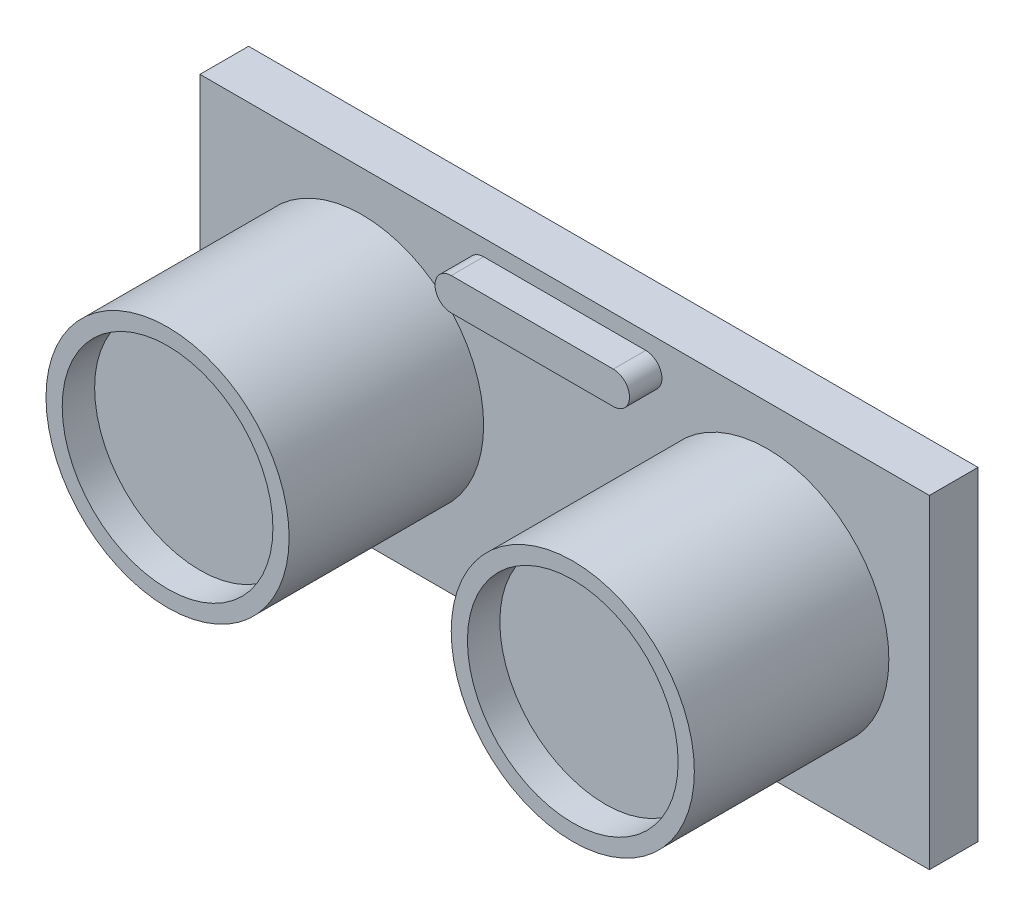
ISO-10303-21;
HEADER;
FILE_DESCRIPTION(('STEP AP214'),'2;1');
FILE_NAME('part.step','',(''),(''),'','','');
FILE_SCHEMA(('AUTOMOTIVE_DESIGN { 1 0 10303 214 1 1 1 1 }'));
ENDSEC;
DATA;
#1=APPLICATION_CONTEXT('core data for automotive mechanical design processes');
#2=APPLICATION_PROTOCOL_DEFINITION('international standard','automotive_design',2000,#1);
#3=PRODUCT_CONTEXT('',#1,'mechanical');
#4=PRODUCT('Part','Part','',(#3));
#5=PRODUCT_RELATED_PRODUCT_CATEGORY('part','',(#4));
#6=PRODUCT_DEFINITION_FORMATION('','',#4);
#7=PRODUCT_DEFINITION_CONTEXT('part definition',#1,'design');
#8=PRODUCT_DEFINITION('design','',#6,#7);
#9=PRODUCT_DEFINITION_SHAPE('','',#8);
#10=(LENGTH_UNIT() NAMED_UNIT(*) SI_UNIT(.MILLI.,.METRE.));
#11=(NAMED_UNIT(*) PLANE_ANGLE_UNIT() SI_UNIT($,.RADIAN.));
#12=(NAMED_UNIT(*) SI_UNIT($,.STERADIAN.) SOLID_ANGLE_UNIT());
#13=UNCERTAINTY_MEASURE_WITH_UNIT(LENGTH_MEASURE(1.E-05),#10,'distance_accuracy_value','');
#14=(GEOMETRIC_REPRESENTATION_CONTEXT(3) GLOBAL_UNCERTAINTY_ASSIGNED_CONTEXT((#13)) GLOBAL_UNIT_ASSIGNED_CONTEXT((#10,
#11,#12)) REPRESENTATION_CONTEXT('',''));
#15=CARTESIAN_POINT('',(0.,0.,0.));
#16=DIRECTION('',(0.,0.,1.));
#17=DIRECTION('',(1.,0.,0.));
#18=AXIS2_PLACEMENT_3D('',#15,#16,#17);
#19=CARTESIAN_POINT('',(0.,0.,3.));
#20=DIRECTION('',(0.,0.,-1.));
#21=DIRECTION('',(-1.,0.,0.));
#22=AXIS2_PLACEMENT_3D('',#19,#20,#21);
#23=PLANE('',#22);
#24=DIRECTION('',(0.,-1.,0.));
#25=VECTOR('',#24,1.);
#26=CARTESIAN_POINT('',(0.,0.,3.));
#27=LINE('',#26,#25);
#28=CARTESIAN_POINT('',(0.,20.,3.));
#29=VERTEX_POINT('',#28);
#30=CARTESIAN_POINT('',(0.,0.,3.));
#31=VERTEX_POINT('',#30);
#32=EDGE_CURVE('E156',#29,#31,#27,.T.);
#33=ORIENTED_EDGE('',*,*,#32,.T.);
#34=DIRECTION('',(1.,0.,0.));
#35=VECTOR('',#34,1.);
#36=CARTESIAN_POINT('',(0.,0.,3.));
#37=LINE('',#36,#35);
#38=CARTESIAN_POINT('',(45.,0.,3.));
#39=VERTEX_POINT('',#38);
#40=EDGE_CURVE('E160',#31,#39,#37,.T.);
#41=ORIENTED_EDGE('',*,*,#40,.T.);
#42=DIRECTION('',(0.,1.,0.));
#43=VECTOR('',#42,1.);
#44=CARTESIAN_POINT('',(45.,0.,3.));
#45=LINE('',#44,#43);
#46=CARTESIAN_POINT('',(45.,20.,3.));
#47=VERTEX_POINT('',#46);
#48=EDGE_CURVE('E164',#39,#47,#45,.T.);
#49=ORIENTED_EDGE('',*,*,#48,.T.);
#50=DIRECTION('',(-1.,0.,0.));
#51=VECTOR('',#50,1.);
#52=CARTESIAN_POINT('',(0.,20.,3.));
#53=LINE('',#52,#51);
#54=EDGE_CURVE('E167',#47,#29,#53,.T.);
#55=ORIENTED_EDGE('',*,*,#54,.T.);
#56=EDGE_LOOP('',(#33,#41,#49,#55));
#57=FACE_BOUND('',#56,.T.);
#58=CARTESIAN_POINT('',(10.,10.,3.));
#59=DIRECTION('',(0.,0.,-1.));
#60=DIRECTION('',(-1.,0.,0.));
#61=AXIS2_PLACEMENT_3D('',#58,#59,#60);
#62=CIRCLE('',#61,7.5);
#63=CARTESIAN_POINT('',(2.5,10.,3.));
#64=VERTEX_POINT('',#63);
#65=EDGE_CURVE('E197',#64,#64,#62,.F.);
#66=ORIENTED_EDGE('',*,*,#65,.F.);
#67=EDGE_LOOP('',(#66));
#68=FACE_BOUND('',#67,.T.);
#69=CARTESIAN_POINT('',(35.,10.,3.));
#70=DIRECTION('',(0.,0.,-1.));
#71=DIRECTION('',(-1.,0.,0.));
#72=AXIS2_PLACEMENT_3D('',#69,#70,#71);
#73=CIRCLE('',#72,7.5);
#74=CARTESIAN_POINT('',(27.5,10.,3.));
#75=VERTEX_POINT('',#74);
#76=EDGE_CURVE('E201',#75,#75,#73,.F.);
#77=ORIENTED_EDGE('',*,*,#76,.F.);
#78=EDGE_LOOP('',(#77));
#79=FACE_BOUND('',#78,.T.);
#80=CARTESIAN_POINT('',(17.5,18.,3.));
#81=DIRECTION('',(0.,0.,1.));
#82=DIRECTION('',(1.,0.,0.));
#83=AXIS2_PLACEMENT_3D('',#80,#81,#82);
#84=CIRCLE('',#83,1.);
#85=CARTESIAN_POINT('',(17.5,19.,3.));
#86=VERTEX_POINT('',#85);
#87=CARTESIAN_POINT('',(17.5,17.,3.));
#88=VERTEX_POINT('',#87);
#89=EDGE_CURVE('E131',#86,#88,#84,.T.);
#90=ORIENTED_EDGE('',*,*,#89,.F.);
#91=DIRECTION('',(-1.,0.,0.));
#92=VECTOR('',#91,1.);
#93=CARTESIAN_POINT('',(17.5,19.,3.));
#94=LINE('',#93,#92);
#95=CARTESIAN_POINT('',(27.5,19.,3.));
#96=VERTEX_POINT('',#95);
#97=EDGE_CURVE('E128',#96,#86,#94,.T.);
#98=ORIENTED_EDGE('',*,*,#97,.F.);
#99=CARTESIAN_POINT('',(27.5,18.,3.));
#100=DIRECTION('',(0.,0.,1.));
#101=DIRECTION('',(1.,0.,0.));
#102=AXIS2_PLACEMENT_3D('',#99,#100,#101);
#103=CIRCLE('',#102,1.);
#104=CARTESIAN_POINT('',(27.5,17.,3.));
#105=VERTEX_POINT('',#104);
#106=EDGE_CURVE('E64',#105,#96,#103,.T.);
#107=ORIENTED_EDGE('',*,*,#106,.F.);
#108=DIRECTION('',(1.,0.,0.));
#109=VECTOR('',#108,1.);
#110=CARTESIAN_POINT('',(17.5,17.,3.));
#111=LINE('',#110,#109);
#112=EDGE_CURVE('E59',#88,#105,#111,.T.);
#113=ORIENTED_EDGE('',*,*,#112,.F.);
#114=EDGE_LOOP('',(#90,#98,#107,#113));
#115=FACE_BOUND('',#114,.T.);
#116=ADVANCED_FACE('F43',(#57,#68,#79,#115),#23,.F.);
#117=CARTESIAN_POINT('',(0.,0.,3.));
#118=DIRECTION('',(1.,0.,0.));
#119=DIRECTION('',(0.,0.,-1.));
#120=AXIS2_PLACEMENT_3D('',#117,#118,#119);
#121=PLANE('',#120);
#122=DIRECTION('',(0.,-1.,0.));
#123=VECTOR('',#122,1.);
#124=CARTESIAN_POINT('',(0.,0.,0.));
#125=LINE('',#124,#123);
#126=CARTESIAN_POINT('',(0.,20.,0.));
#127=VERTEX_POINT('',#126);
#128=CARTESIAN_POINT('',(0.,0.,0.));
#129=VERTEX_POINT('',#128);
#130=EDGE_CURVE('E155',#127,#129,#125,.T.);
#131=ORIENTED_EDGE('',*,*,#130,.T.);
#132=DIRECTION('',(0.,0.,-1.));
#133=VECTOR('',#132,1.);
#134=CARTESIAN_POINT('',(0.,0.,3.));
#135=LINE('',#134,#133);
#136=EDGE_CURVE('E193',#31,#129,#135,.T.);
#137=ORIENTED_EDGE('',*,*,#136,.F.);
#138=ORIENTED_EDGE('',*,*,#32,.F.);
#139=DIRECTION('',(0.,0.,-1.));
#140=VECTOR('',#139,1.);
#141=CARTESIAN_POINT('',(0.,20.,3.));
#142=LINE('',#141,#140);
#143=EDGE_CURVE('E170',#29,#127,#142,.T.);
#144=ORIENTED_EDGE('',*,*,#143,.T.);
#145=EDGE_LOOP('',(#131,#137,#138,#144));
#146=FACE_BOUND('',#145,.T.);
#147=ADVANCED_FACE('F45',(#146),#121,.F.);
#148=CARTESIAN_POINT('',(0.,0.,3.));
#149=DIRECTION('',(0.,1.,0.));
#150=DIRECTION('',(0.,0.,1.));
#151=AXIS2_PLACEMENT_3D('',#148,#149,#150);
#152=PLANE('',#151);
#153=DIRECTION('',(1.,0.,0.));
#154=VECTOR('',#153,1.);
#155=CARTESIAN_POINT('',(0.,0.,0.));
#156=LINE('',#155,#154);
#157=CARTESIAN_POINT('',(45.,0.,0.));
#158=VERTEX_POINT('',#157);
#159=EDGE_CURVE('E174',#129,#158,#156,.T.);
#160=ORIENTED_EDGE('',*,*,#159,.T.);
#161=DIRECTION('',(0.,0.,-1.));
#162=VECTOR('',#161,1.);
#163=CARTESIAN_POINT('',(45.,0.,3.));
#164=LINE('',#163,#162);
#165=EDGE_CURVE('E189',#39,#158,#164,.T.);
#166=ORIENTED_EDGE('',*,*,#165,.F.);
#167=ORIENTED_EDGE('',*,*,#40,.F.);
#168=ORIENTED_EDGE('',*,*,#136,.T.);
#169=EDGE_LOOP('',(#160,#166,#167,#168));
#170=FACE_BOUND('',#169,.T.);
#171=ADVANCED_FACE('F238',(#170),#152,.F.);
#172=CARTESIAN_POINT('',(45.,0.,3.));
#173=DIRECTION('',(-1.,0.,0.));
#174=DIRECTION('',(0.,0.,1.));
#175=AXIS2_PLACEMENT_3D('',#172,#173,#174);
#176=PLANE('',#175);
#177=DIRECTION('',(0.,1.,0.));
#178=VECTOR('',#177,1.);
#179=CARTESIAN_POINT('',(45.,0.,0.));
#180=LINE('',#179,#178);
#181=CARTESIAN_POINT('',(45.,20.,0.));
#182=VERTEX_POINT('',#181);
#183=EDGE_CURVE('E177',#158,#182,#180,.T.);
#184=ORIENTED_EDGE('',*,*,#183,.T.);
#185=DIRECTION('',(0.,0.,-1.));
#186=VECTOR('',#185,1.);
#187=CARTESIAN_POINT('',(45.,20.,3.));
#188=LINE('',#187,#186);
#189=EDGE_CURVE('E185',#47,#182,#188,.T.);
#190=ORIENTED_EDGE('',*,*,#189,.F.);
#191=ORIENTED_EDGE('',*,*,#48,.F.);
#192=ORIENTED_EDGE('',*,*,#165,.T.);
#193=EDGE_LOOP('',(#184,#190,#191,#192));
#194=FACE_BOUND('',#193,.T.);
#195=ADVANCED_FACE('F244',(#194),#176,.F.);
#196=CARTESIAN_POINT('',(0.,20.,3.));
#197=DIRECTION('',(0.,-1.,0.));
#198=DIRECTION('',(0.,0.,-1.));
#199=AXIS2_PLACEMENT_3D('',#196,#197,#198);
#200=PLANE('',#199);
#201=DIRECTION('',(-1.,0.,0.));
#202=VECTOR('',#201,1.);
#203=CARTESIAN_POINT('',(0.,20.,0.));
#204=LINE('',#203,#202);
#205=EDGE_CURVE('E161',#182,#127,#204,.T.);
#206=ORIENTED_EDGE('',*,*,#205,.T.);
#207=ORIENTED_EDGE('',*,*,#143,.F.);
#208=ORIENTED_EDGE('',*,*,#54,.F.);
#209=ORIENTED_EDGE('',*,*,#189,.T.);
#210=EDGE_LOOP('',(#206,#207,#208,#209));
#211=FACE_BOUND('',#210,.T.);
#212=ADVANCED_FACE('F229',(#211),#200,.F.);
#213=CARTESIAN_POINT('',(0.,0.,0.));
#214=DIRECTION('',(0.,0.,-1.));
#215=DIRECTION('',(-1.,0.,0.));
#216=AXIS2_PLACEMENT_3D('',#213,#214,#215);
#217=PLANE('',#216);
#218=ORIENTED_EDGE('',*,*,#130,.F.);
#219=ORIENTED_EDGE('',*,*,#205,.F.);
#220=ORIENTED_EDGE('',*,*,#183,.F.);
#221=ORIENTED_EDGE('',*,*,#159,.F.);
#222=EDGE_LOOP('',(#218,#219,#220,#221));
#223=FACE_BOUND('',#222,.T.);
#224=ADVANCED_FACE('F220',(#223),#217,.T.);
#225=CARTESIAN_POINT('',(10.,10.,15.));
#226=DIRECTION('',(0.,0.,1.));
#227=DIRECTION('',(1.,0.,0.));
#228=AXIS2_PLACEMENT_3D('',#225,#226,#227);
#229=PLANE('',#228);
#230=CARTESIAN_POINT('',(10.,10.,15.));
#231=DIRECTION('',(0.,0.,1.));
#232=DIRECTION('',(1.,0.,0.));
#233=AXIS2_PLACEMENT_3D('',#230,#231,#232);
#234=CIRCLE('',#233,7.5);
#235=CARTESIAN_POINT('',(17.5,10.,15.));
#236=VERTEX_POINT('',#235);
#237=EDGE_CURVE('E151',#236,#236,#234,.T.);
#238=ORIENTED_EDGE('',*,*,#237,.T.);
#239=EDGE_LOOP('',(#238));
#240=FACE_BOUND('',#239,.T.);
#241=CARTESIAN_POINT('',(10.,10.,15.));
#242=DIRECTION('',(0.,0.,1.));
#243=DIRECTION('',(1.,0.,0.));
#244=AXIS2_PLACEMENT_3D('',#241,#242,#243);
#245=CIRCLE('',#244,6.5);
#246=CARTESIAN_POINT('',(16.5,10.,15.));
#247=VERTEX_POINT('',#246);
#248=EDGE_CURVE('E147',#247,#247,#245,.T.);
#249=ORIENTED_EDGE('',*,*,#248,.F.);
#250=EDGE_LOOP('',(#249));
#251=FACE_BOUND('',#250,.T.);
#252=ADVANCED_FACE('F218',(#240,#251),#229,.T.);
#253=CARTESIAN_POINT('',(10.,10.,15.));
#254=DIRECTION('',(0.,0.,-1.));
#255=DIRECTION('',(-1.,0.,0.));
#256=AXIS2_PLACEMENT_3D('',#253,#254,#255);
#257=CYLINDRICAL_SURFACE('',#256,7.5);
#258=ORIENTED_EDGE('',*,*,#237,.F.);
#259=EDGE_LOOP('',(#258));
#260=FACE_BOUND('',#259,.T.);
#261=ORIENTED_EDGE('',*,*,#65,.T.);
#262=EDGE_LOOP('',(#261));
#263=FACE_BOUND('',#262,.T.);
#264=ADVANCED_FACE('F214',(#260,#263),#257,.T.);
#265=CARTESIAN_POINT('',(10.,10.,15.));
#266=DIRECTION('',(0.,0.,-1.));
#267=DIRECTION('',(-1.,0.,0.));
#268=AXIS2_PLACEMENT_3D('',#265,#266,#267);
#269=CYLINDRICAL_SURFACE('',#268,6.5);
#270=CARTESIAN_POINT('',(10.,10.,13.));
#271=DIRECTION('',(0.,0.,1.));
#272=DIRECTION('',(1.,0.,0.));
#273=AXIS2_PLACEMENT_3D('',#270,#271,#272);
#274=CIRCLE('',#273,6.5);
#275=CARTESIAN_POINT('',(16.5,10.,13.));
#276=VERTEX_POINT('',#275);
#277=EDGE_CURVE('E52',#276,#276,#274,.T.);
#278=ORIENTED_EDGE('',*,*,#277,.F.);
#279=EDGE_LOOP('',(#278));
#280=FACE_BOUND('',#279,.T.);
#281=ORIENTED_EDGE('',*,*,#248,.T.);
#282=EDGE_LOOP('',(#281));
#283=FACE_BOUND('',#282,.T.);
#284=ADVANCED_FACE('F210',(#280,#283),#269,.F.);
#285=CARTESIAN_POINT('',(35.,10.,15.));
#286=DIRECTION('',(0.,0.,1.));
#287=DIRECTION('',(1.,0.,0.));
#288=AXIS2_PLACEMENT_3D('',#285,#286,#287);
#289=PLANE('',#288);
#290=CARTESIAN_POINT('',(35.,10.,15.));
#291=DIRECTION('',(0.,0.,1.));
#292=DIRECTION('',(1.,0.,0.));
#293=AXIS2_PLACEMENT_3D('',#290,#291,#292);
#294=CIRCLE('',#293,7.5);
#295=CARTESIAN_POINT('',(42.5,10.,15.));
#296=VERTEX_POINT('',#295);
#297=EDGE_CURVE('E138',#296,#296,#294,.T.);
#298=ORIENTED_EDGE('',*,*,#297,.T.);
#299=EDGE_LOOP('',(#298));
#300=FACE_BOUND('',#299,.T.);
#301=CARTESIAN_POINT('',(35.,10.,15.));
#302=DIRECTION('',(0.,0.,1.));
#303=DIRECTION('',(1.,0.,0.));
#304=AXIS2_PLACEMENT_3D('',#301,#302,#303);
#305=CIRCLE('',#304,6.5);
#306=CARTESIAN_POINT('',(41.5,10.,15.));
#307=VERTEX_POINT('',#306);
#308=EDGE_CURVE('E133',#307,#307,#305,.T.);
#309=ORIENTED_EDGE('',*,*,#308,.F.);
#310=EDGE_LOOP('',(#309));
#311=FACE_BOUND('',#310,.T.);
#312=ADVANCED_FACE('F213',(#300,#311),#289,.T.);
#313=CARTESIAN_POINT('',(35.,10.,15.));
#314=DIRECTION('',(0.,0.,-1.));
#315=DIRECTION('',(-1.,0.,0.));
#316=AXIS2_PLACEMENT_3D('',#313,#314,#315);
#317=CYLINDRICAL_SURFACE('',#316,7.5);
#318=ORIENTED_EDGE('',*,*,#297,.F.);
#319=EDGE_LOOP('',(#318));
#320=FACE_BOUND('',#319,.T.);
#321=ORIENTED_EDGE('',*,*,#76,.T.);
#322=EDGE_LOOP('',(#321));
#323=FACE_BOUND('',#322,.T.);
#324=ADVANCED_FACE('F306',(#320,#323),#317,.T.);
#325=CARTESIAN_POINT('',(35.,10.,15.));
#326=DIRECTION('',(0.,0.,-1.));
#327=DIRECTION('',(-1.,0.,0.));
#328=AXIS2_PLACEMENT_3D('',#325,#326,#327);
#329=CYLINDRICAL_SURFACE('',#328,6.5);
#330=CARTESIAN_POINT('',(35.,10.,13.));
#331=DIRECTION('',(0.,0.,1.));
#332=DIRECTION('',(1.,0.,0.));
#333=AXIS2_PLACEMENT_3D('',#330,#331,#332);
#334=CIRCLE('',#333,6.5);
#335=CARTESIAN_POINT('',(41.5,10.,13.));
#336=VERTEX_POINT('',#335);
#337=EDGE_CURVE('E11',#336,#336,#334,.T.);
#338=ORIENTED_EDGE('',*,*,#337,.F.);
#339=EDGE_LOOP('',(#338));
#340=FACE_BOUND('',#339,.T.);
#341=ORIENTED_EDGE('',*,*,#308,.T.);
#342=EDGE_LOOP('',(#341));
#343=FACE_BOUND('',#342,.T.);
#344=ADVANCED_FACE('F316',(#340,#343),#329,.F.);
#345=CARTESIAN_POINT('',(0.,0.,13.));
#346=DIRECTION('',(0.,0.,1.));
#347=DIRECTION('',(1.,0.,0.));
#348=AXIS2_PLACEMENT_3D('',#345,#346,#347);
#349=PLANE('',#348);
#350=ORIENTED_EDGE('',*,*,#277,.T.);
#351=EDGE_LOOP('',(#350));
#352=FACE_BOUND('',#351,.T.);
#353=ADVANCED_FACE('F208',(#352),#349,.T.);
#354=CARTESIAN_POINT('',(0.,0.,13.));
#355=DIRECTION('',(0.,0.,1.));
#356=DIRECTION('',(1.,0.,0.));
#357=AXIS2_PLACEMENT_3D('',#354,#355,#356);
#358=PLANE('',#357);
#359=ORIENTED_EDGE('',*,*,#337,.T.);
#360=EDGE_LOOP('',(#359));
#361=FACE_BOUND('',#360,.T.);
#362=ADVANCED_FACE('F341',(#361),#358,.T.);
#363=CARTESIAN_POINT('',(17.5,18.,5.));
#364=DIRECTION('',(0.,0.,-1.));
#365=DIRECTION('',(-1.,0.,0.));
#366=AXIS2_PLACEMENT_3D('',#363,#364,#365);
#367=CYLINDRICAL_SURFACE('',#366,1.);
#368=ORIENTED_EDGE('',*,*,#89,.T.);
#369=DIRECTION('',(0.,0.,-1.));
#370=VECTOR('',#369,1.);
#371=CARTESIAN_POINT('',(17.5,17.,5.));
#372=LINE('',#371,#370);
#373=CARTESIAN_POINT('',(17.5,17.,5.));
#374=VERTEX_POINT('',#373);
#375=EDGE_CURVE('E110',#374,#88,#372,.T.);
#376=ORIENTED_EDGE('',*,*,#375,.F.);
#377=CARTESIAN_POINT('',(17.5,18.,5.));
#378=DIRECTION('',(0.,0.,1.));
#379=DIRECTION('',(1.,0.,0.));
#380=AXIS2_PLACEMENT_3D('',#377,#378,#379);
#381=CIRCLE('',#380,1.);
#382=CARTESIAN_POINT('',(17.5,19.,5.));
#383=VERTEX_POINT('',#382);
#384=EDGE_CURVE('E118',#383,#374,#381,.T.);
#385=ORIENTED_EDGE('',*,*,#384,.F.);
#386=DIRECTION('',(0.,0.,-1.));
#387=VECTOR('',#386,1.);
#388=CARTESIAN_POINT('',(17.5,19.,5.));
#389=LINE('',#388,#387);
#390=EDGE_CURVE('E413',#383,#86,#389,.T.);
#391=ORIENTED_EDGE('',*,*,#390,.T.);
#392=EDGE_LOOP('',(#368,#376,#385,#391));
#393=FACE_BOUND('',#392,.T.);
#394=ADVANCED_FACE('F130',(#393),#367,.T.);
#395=CARTESIAN_POINT('',(17.5,17.,5.));
#396=DIRECTION('',(0.,1.,0.));
#397=DIRECTION('',(0.,0.,1.));
#398=AXIS2_PLACEMENT_3D('',#395,#396,#397);
#399=PLANE('',#398);
#400=ORIENTED_EDGE('',*,*,#112,.T.);
#401=DIRECTION('',(0.,0.,-1.));
#402=VECTOR('',#401,1.);
#403=CARTESIAN_POINT('',(27.5,17.,5.));
#404=LINE('',#403,#402);
#405=CARTESIAN_POINT('',(27.5,17.,5.));
#406=VERTEX_POINT('',#405);
#407=EDGE_CURVE('E113',#406,#105,#404,.T.);
#408=ORIENTED_EDGE('',*,*,#407,.F.);
#409=DIRECTION('',(1.,0.,0.));
#410=VECTOR('',#409,1.);
#411=CARTESIAN_POINT('',(17.5,17.,5.));
#412=LINE('',#411,#410);
#413=EDGE_CURVE('E106',#374,#406,#412,.T.);
#414=ORIENTED_EDGE('',*,*,#413,.F.);
#415=ORIENTED_EDGE('',*,*,#375,.T.);
#416=EDGE_LOOP('',(#400,#408,#414,#415));
#417=FACE_BOUND('',#416,.T.);
#418=ADVANCED_FACE('F108',(#417),#399,.F.);
#419=CARTESIAN_POINT('',(27.5,18.,5.));
#420=DIRECTION('',(0.,0.,-1.));
#421=DIRECTION('',(-1.,0.,0.));
#422=AXIS2_PLACEMENT_3D('',#419,#420,#421);
#423=CYLINDRICAL_SURFACE('',#422,1.);
#424=ORIENTED_EDGE('',*,*,#106,.T.);
#425=DIRECTION('',(0.,0.,-1.));
#426=VECTOR('',#425,1.);
#427=CARTESIAN_POINT('',(27.5,19.,5.));
#428=LINE('',#427,#426);
#429=CARTESIAN_POINT('',(27.5,19.,5.));
#430=VERTEX_POINT('',#429);
#431=EDGE_CURVE('E140',#430,#96,#428,.T.);
#432=ORIENTED_EDGE('',*,*,#431,.F.);
#433=CARTESIAN_POINT('',(27.5,18.,5.));
#434=DIRECTION('',(0.,0.,1.));
#435=DIRECTION('',(1.,0.,0.));
#436=AXIS2_PLACEMENT_3D('',#433,#434,#435);
#437=CIRCLE('',#436,1.);
#438=EDGE_CURVE('E117',#406,#430,#437,.T.);
#439=ORIENTED_EDGE('',*,*,#438,.F.);
#440=ORIENTED_EDGE('',*,*,#407,.T.);
#441=EDGE_LOOP('',(#424,#432,#439,#440));
#442=FACE_BOUND('',#441,.T.);
#443=ADVANCED_FACE('F376',(#442),#423,.T.);
#444=CARTESIAN_POINT('',(17.5,19.,5.));
#445=DIRECTION('',(0.,-1.,0.));
#446=DIRECTION('',(0.,0.,-1.));
#447=AXIS2_PLACEMENT_3D('',#444,#445,#446);
#448=PLANE('',#447);
#449=ORIENTED_EDGE('',*,*,#97,.T.);
#450=ORIENTED_EDGE('',*,*,#390,.F.);
#451=DIRECTION('',(-1.,0.,0.));
#452=VECTOR('',#451,1.);
#453=CARTESIAN_POINT('',(17.5,19.,5.));
#454=LINE('',#453,#452);
#455=EDGE_CURVE('E123',#430,#383,#454,.T.);
#456=ORIENTED_EDGE('',*,*,#455,.F.);
#457=ORIENTED_EDGE('',*,*,#431,.T.);
#458=EDGE_LOOP('',(#449,#450,#456,#457));
#459=FACE_BOUND('',#458,.T.);
#460=ADVANCED_FACE('F385',(#459),#448,.F.);
#461=CARTESIAN_POINT('',(17.5,18.,5.));
#462=DIRECTION('',(0.,0.,1.));
#463=DIRECTION('',(1.,0.,0.));
#464=AXIS2_PLACEMENT_3D('',#461,#462,#463);
#465=PLANE('',#464);
#466=ORIENTED_EDGE('',*,*,#384,.T.);
#467=ORIENTED_EDGE('',*,*,#413,.T.);
#468=ORIENTED_EDGE('',*,*,#438,.T.);
#469=ORIENTED_EDGE('',*,*,#455,.T.);
#470=EDGE_LOOP('',(#466,#467,#468,#469));
#471=FACE_BOUND('',#470,.T.);
#472=ADVANCED_FACE('F121',(#471),#465,.T.);
#473=CLOSED_SHELL('',(#116,#147,#171,#195,#212,#224,#252,#264,#284,#312,#324,#344,#353,#362,
#394,#418,#443,#460,#472));
#474=MANIFOLD_SOLID_BREP('B2',#473);
#475=ADVANCED_BREP_SHAPE_REPRESENTATION('',(#18,#474),#14);
#476=SHAPE_DEFINITION_REPRESENTATION(#9,#475);
ENDSEC;
END-ISO-10303-21;
